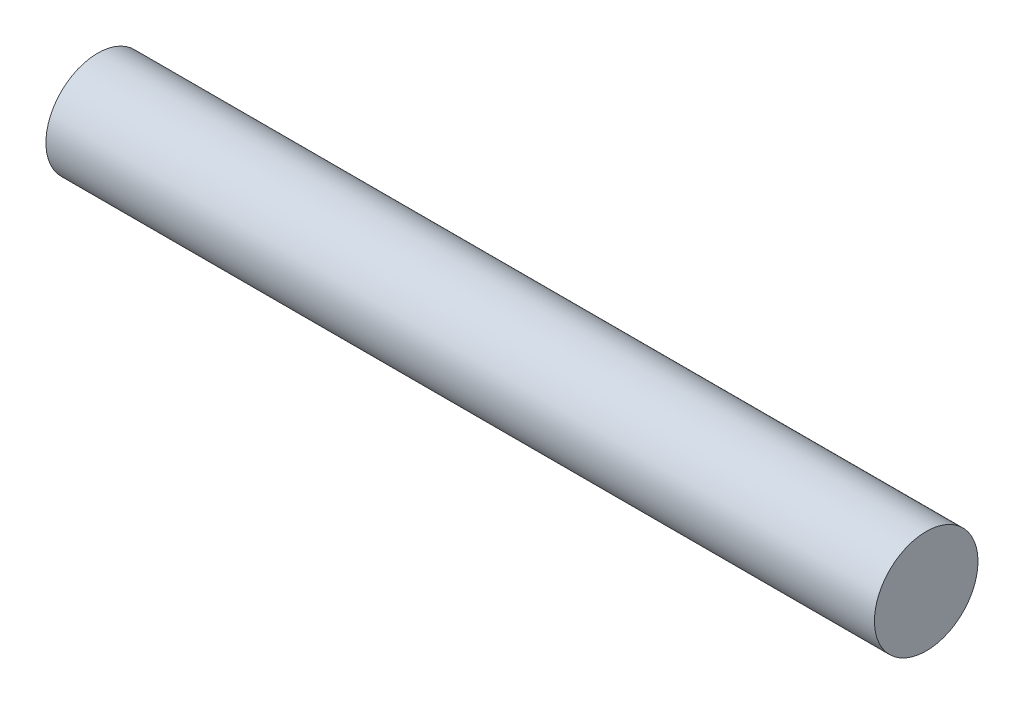
ISO-10303-21;
HEADER;
FILE_DESCRIPTION(('STEP AP214'),'2;1');
FILE_NAME('part.step','',(''),(''),'','','');
FILE_SCHEMA(('AUTOMOTIVE_DESIGN { 1 0 10303 214 1 1 1 1 }'));
ENDSEC;
DATA;
#1=APPLICATION_CONTEXT('core data for automotive mechanical design processes');
#2=APPLICATION_PROTOCOL_DEFINITION('international standard','automotive_design',2000,#1);
#3=PRODUCT_CONTEXT('',#1,'mechanical');
#4=PRODUCT('Part','Part','',(#3));
#5=PRODUCT_RELATED_PRODUCT_CATEGORY('part','',(#4));
#6=PRODUCT_DEFINITION_FORMATION('','',#4);
#7=PRODUCT_DEFINITION_CONTEXT('part definition',#1,'design');
#8=PRODUCT_DEFINITION('design','',#6,#7);
#9=PRODUCT_DEFINITION_SHAPE('','',#8);
#10=(LENGTH_UNIT() NAMED_UNIT(*) SI_UNIT(.MILLI.,.METRE.));
#11=(NAMED_UNIT(*) PLANE_ANGLE_UNIT() SI_UNIT($,.RADIAN.));
#12=(NAMED_UNIT(*) SI_UNIT($,.STERADIAN.) SOLID_ANGLE_UNIT());
#13=UNCERTAINTY_MEASURE_WITH_UNIT(LENGTH_MEASURE(1.E-05),#10,'distance_accuracy_value','');
#14=(GEOMETRIC_REPRESENTATION_CONTEXT(3) GLOBAL_UNCERTAINTY_ASSIGNED_CONTEXT((#13)) GLOBAL_UNIT_ASSIGNED_CONTEXT((#10,
#11,#12)) REPRESENTATION_CONTEXT('',''));
#15=CARTESIAN_POINT('',(0.,0.,0.));
#16=DIRECTION('',(0.,0.,1.));
#17=DIRECTION('',(1.,0.,0.));
#18=AXIS2_PLACEMENT_3D('',#15,#16,#17);
#19=CARTESIAN_POINT('',(6.35,0.,0.));
#20=DIRECTION('',(-1.,0.,0.));
#21=DIRECTION('',(0.,0.,1.));
#22=AXIS2_PLACEMENT_3D('',#19,#20,#21);
#23=CYLINDRICAL_SURFACE('',#22,0.79375);
#24=CARTESIAN_POINT('',(6.35,0.,0.));
#25=DIRECTION('',(1.,0.,0.));
#26=DIRECTION('',(0.,0.,-1.));
#27=AXIS2_PLACEMENT_3D('',#24,#25,#26);
#28=CIRCLE('',#27,0.79375);
#29=CARTESIAN_POINT('',(6.35,0.,-0.79375));
#30=VERTEX_POINT('',#29);
#31=EDGE_CURVE('E10',#30,#30,#28,.T.);
#32=ORIENTED_EDGE('',*,*,#31,.F.);
#33=EDGE_LOOP('',(#32));
#34=FACE_BOUND('',#33,.T.);
#35=CARTESIAN_POINT('',(-6.35,0.,0.));
#36=DIRECTION('',(1.,0.,0.));
#37=DIRECTION('',(0.,0.,-1.));
#38=AXIS2_PLACEMENT_3D('',#35,#36,#37);
#39=CIRCLE('',#38,0.79375);
#40=CARTESIAN_POINT('',(-6.35,0.,-0.79375));
#41=VERTEX_POINT('',#40);
#42=EDGE_CURVE('E34',#41,#41,#39,.T.);
#43=ORIENTED_EDGE('',*,*,#42,.T.);
#44=EDGE_LOOP('',(#43));
#45=FACE_BOUND('',#44,.T.);
#46=ADVANCED_FACE('F31',(#34,#45),#23,.T.);
#47=CARTESIAN_POINT('',(6.35,0.,0.));
#48=DIRECTION('',(1.,0.,0.));
#49=DIRECTION('',(0.,0.,-1.));
#50=AXIS2_PLACEMENT_3D('',#47,#48,#49);
#51=PLANE('',#50);
#52=ORIENTED_EDGE('',*,*,#31,.T.);
#53=EDGE_LOOP('',(#52));
#54=FACE_BOUND('',#53,.T.);
#55=ADVANCED_FACE('F46',(#54),#51,.T.);
#56=CARTESIAN_POINT('',(-6.35,0.,0.));
#57=DIRECTION('',(1.,0.,0.));
#58=DIRECTION('',(0.,0.,-1.));
#59=AXIS2_PLACEMENT_3D('',#56,#57,#58);
#60=PLANE('',#59);
#61=ORIENTED_EDGE('',*,*,#42,.F.);
#62=EDGE_LOOP('',(#61));
#63=FACE_BOUND('',#62,.T.);
#64=ADVANCED_FACE('F44',(#63),#60,.F.);
#65=CLOSED_SHELL('',(#46,#55,#64));
#66=MANIFOLD_SOLID_BREP('B2',#65);
#67=ADVANCED_BREP_SHAPE_REPRESENTATION('',(#18,#66),#14);
#68=SHAPE_DEFINITION_REPRESENTATION(#9,#67);
ENDSEC;
END-ISO-10303-21;
